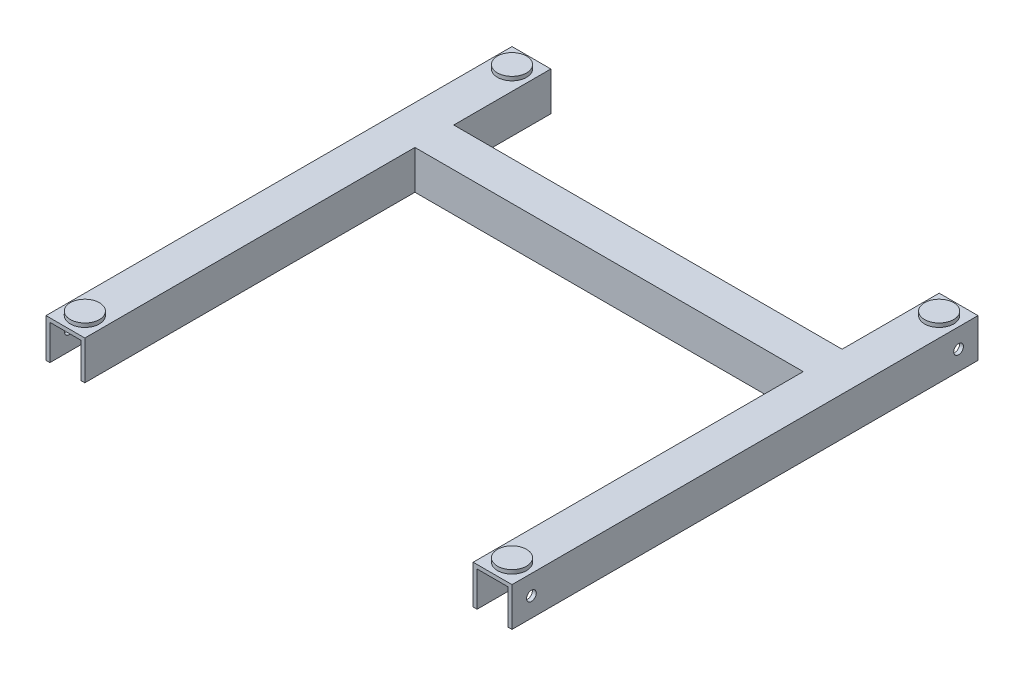
ISO-10303-21;
HEADER;
FILE_DESCRIPTION(('STEP AP214'),'2;1');
FILE_NAME('part.step','',(''),(''),'','','');
FILE_SCHEMA(('AUTOMOTIVE_DESIGN { 1 0 10303 214 1 1 1 1 }'));
ENDSEC;
DATA;
#1=APPLICATION_CONTEXT('core data for automotive mechanical design processes');
#2=APPLICATION_PROTOCOL_DEFINITION('international standard','automotive_design',2000,#1);
#3=PRODUCT_CONTEXT('',#1,'mechanical');
#4=PRODUCT('Part','Part','',(#3));
#5=PRODUCT_RELATED_PRODUCT_CATEGORY('part','',(#4));
#6=PRODUCT_DEFINITION_FORMATION('','',#4);
#7=PRODUCT_DEFINITION_CONTEXT('part definition',#1,'design');
#8=PRODUCT_DEFINITION('design','',#6,#7);
#9=PRODUCT_DEFINITION_SHAPE('','',#8);
#10=(LENGTH_UNIT() NAMED_UNIT(*) SI_UNIT(.MILLI.,.METRE.));
#11=(NAMED_UNIT(*) PLANE_ANGLE_UNIT() SI_UNIT($,.RADIAN.));
#12=(NAMED_UNIT(*) SI_UNIT($,.STERADIAN.) SOLID_ANGLE_UNIT());
#13=UNCERTAINTY_MEASURE_WITH_UNIT(LENGTH_MEASURE(1.E-05),#10,'distance_accuracy_value','');
#14=(GEOMETRIC_REPRESENTATION_CONTEXT(3) GLOBAL_UNCERTAINTY_ASSIGNED_CONTEXT((#13)) GLOBAL_UNIT_ASSIGNED_CONTEXT((#10,
#11,#12)) REPRESENTATION_CONTEXT('',''));
#15=CARTESIAN_POINT('',(0.,0.,0.));
#16=DIRECTION('',(0.,0.,1.));
#17=DIRECTION('',(1.,0.,0.));
#18=AXIS2_PLACEMENT_3D('',#15,#16,#17);
#19=CARTESIAN_POINT('',(25.4,25.4,0.));
#20=DIRECTION('',(-1.,0.,0.));
#21=DIRECTION('',(0.,0.,1.));
#22=AXIS2_PLACEMENT_3D('',#19,#20,#21);
#23=PLANE('',#22);
#24=DIRECTION('',(0.,-1.,0.));
#25=VECTOR('',#24,1.);
#26=CARTESIAN_POINT('',(25.4,0.,-215.9));
#27=LINE('',#26,#25);
#28=CARTESIAN_POINT('',(25.4,25.4,-215.9));
#29=VERTEX_POINT('',#28);
#30=CARTESIAN_POINT('',(25.4,0.,-215.9));
#31=VERTEX_POINT('',#30);
#32=EDGE_CURVE('E65',#29,#31,#27,.T.);
#33=ORIENTED_EDGE('',*,*,#32,.F.);
#34=DIRECTION('',(0.,0.,-1.));
#35=VECTOR('',#34,1.);
#36=CARTESIAN_POINT('',(25.4,25.4,0.));
#37=LINE('',#36,#35);
#38=CARTESIAN_POINT('',(25.4,25.4,0.));
#39=VERTEX_POINT('',#38);
#40=EDGE_CURVE('E451',#39,#29,#37,.T.);
#41=ORIENTED_EDGE('',*,*,#40,.F.);
#42=DIRECTION('',(0.,-1.,0.));
#43=VECTOR('',#42,1.);
#44=CARTESIAN_POINT('',(25.4,25.4,0.));
#45=LINE('',#44,#43);
#46=CARTESIAN_POINT('',(25.4,0.,0.));
#47=VERTEX_POINT('',#46);
#48=EDGE_CURVE('E481',#39,#47,#45,.T.);
#49=ORIENTED_EDGE('',*,*,#48,.T.);
#50=DIRECTION('',(0.,0.,-1.));
#51=VECTOR('',#50,1.);
#52=CARTESIAN_POINT('',(25.4,0.,0.));
#53=LINE('',#52,#51);
#54=EDGE_CURVE('E467',#47,#31,#53,.T.);
#55=ORIENTED_EDGE('',*,*,#54,.T.);
#56=EDGE_LOOP('',(#33,#41,#49,#55));
#57=FACE_BOUND('',#56,.T.);
#58=ADVANCED_FACE('F47',(#57),#23,.F.);
#59=DIRECTION('',(0.,1.,0.));
#60=VECTOR('',#59,1.);
#61=CARTESIAN_POINT('',(25.4,0.,-241.3));
#62=LINE('',#61,#60);
#63=CARTESIAN_POINT('',(25.4,0.,-241.3));
#64=VERTEX_POINT('',#63);
#65=CARTESIAN_POINT('',(25.4,25.4,-241.3));
#66=VERTEX_POINT('',#65);
#67=EDGE_CURVE('E73',#64,#66,#62,.T.);
#68=ORIENTED_EDGE('',*,*,#67,.F.);
#69=CARTESIAN_POINT('',(25.4,0.,-304.8));
#70=VERTEX_POINT('',#69);
#71=EDGE_CURVE('E466',#64,#70,#53,.T.);
#72=ORIENTED_EDGE('',*,*,#71,.T.);
#73=DIRECTION('',(0.,-1.,0.));
#74=VECTOR('',#73,1.);
#75=CARTESIAN_POINT('',(25.4,25.4,-304.8));
#76=LINE('',#75,#74);
#77=CARTESIAN_POINT('',(25.4,25.4,-304.8));
#78=VERTEX_POINT('',#77);
#79=EDGE_CURVE('E477',#78,#70,#76,.T.);
#80=ORIENTED_EDGE('',*,*,#79,.F.);
#81=EDGE_CURVE('E450',#66,#78,#37,.T.);
#82=ORIENTED_EDGE('',*,*,#81,.F.);
#83=EDGE_LOOP('',(#68,#72,#80,#82));
#84=FACE_BOUND('',#83,.T.);
#85=ADVANCED_FACE('F596',(#84),#23,.F.);
#86=CARTESIAN_POINT('',(0.,0.,0.));
#87=DIRECTION('',(0.,-1.,0.));
#88=DIRECTION('',(0.,0.,-1.));
#89=AXIS2_PLACEMENT_3D('',#86,#87,#88);
#90=PLANE('',#89);
#91=DIRECTION('',(0.,0.,1.));
#92=VECTOR('',#91,1.);
#93=CARTESIAN_POINT('',(2.54,0.,-304.8));
#94=LINE('',#93,#92);
#95=CARTESIAN_POINT('',(2.54,0.,-304.8));
#96=VERTEX_POINT('',#95);
#97=CARTESIAN_POINT('',(2.54,0.,0.));
#98=VERTEX_POINT('',#97);
#99=EDGE_CURVE('E419',#96,#98,#94,.T.);
#100=ORIENTED_EDGE('',*,*,#99,.T.);
#101=DIRECTION('',(1.,0.,0.));
#102=VECTOR('',#101,1.);
#103=CARTESIAN_POINT('',(0.,0.,0.));
#104=LINE('',#103,#102);
#105=CARTESIAN_POINT('',(0.,0.,0.));
#106=VERTEX_POINT('',#105);
#107=EDGE_CURVE('E462',#106,#98,#104,.T.);
#108=ORIENTED_EDGE('',*,*,#107,.F.);
#109=DIRECTION('',(0.,0.,1.));
#110=VECTOR('',#109,1.);
#111=CARTESIAN_POINT('',(0.,0.,0.));
#112=LINE('',#111,#110);
#113=CARTESIAN_POINT('',(0.,0.,-304.8));
#114=VERTEX_POINT('',#113);
#115=EDGE_CURVE('E432',#114,#106,#112,.T.);
#116=ORIENTED_EDGE('',*,*,#115,.F.);
#117=DIRECTION('',(-1.,0.,0.));
#118=VECTOR('',#117,1.);
#119=CARTESIAN_POINT('',(0.,0.,-304.8));
#120=LINE('',#119,#118);
#121=EDGE_CURVE('E470',#96,#114,#120,.T.);
#122=ORIENTED_EDGE('',*,*,#121,.F.);
#123=EDGE_LOOP('',(#100,#108,#116,#122));
#124=FACE_BOUND('',#123,.T.);
#125=ADVANCED_FACE('F603',(#124),#90,.T.);
#126=CARTESIAN_POINT('',(0.,25.4,0.));
#127=DIRECTION('',(1.,0.,0.));
#128=DIRECTION('',(0.,0.,-1.));
#129=AXIS2_PLACEMENT_3D('',#126,#127,#128);
#130=PLANE('',#129);
#131=CARTESIAN_POINT('',(0.,12.7,-292.1));
#132=DIRECTION('',(-1.,0.,0.));
#133=DIRECTION('',(0.,0.,1.));
#134=AXIS2_PLACEMENT_3D('',#131,#132,#133);
#135=CIRCLE('',#134,3.17499999999997);
#136=CARTESIAN_POINT('',(0.,12.7,-288.925));
#137=VERTEX_POINT('',#136);
#138=EDGE_CURVE('E502',#137,#137,#135,.T.);
#139=ORIENTED_EDGE('',*,*,#138,.F.);
#140=EDGE_LOOP('',(#139));
#141=FACE_BOUND('',#140,.T.);
#142=CARTESIAN_POINT('',(0.,12.7,-12.7));
#143=DIRECTION('',(-1.,0.,0.));
#144=DIRECTION('',(0.,0.,1.));
#145=AXIS2_PLACEMENT_3D('',#142,#143,#144);
#146=CIRCLE('',#145,3.175);
#147=CARTESIAN_POINT('',(0.,12.7,-9.525));
#148=VERTEX_POINT('',#147);
#149=EDGE_CURVE('E510',#148,#148,#146,.T.);
#150=ORIENTED_EDGE('',*,*,#149,.F.);
#151=EDGE_LOOP('',(#150));
#152=FACE_BOUND('',#151,.T.);
#153=ORIENTED_EDGE('',*,*,#115,.T.);
#154=DIRECTION('',(0.,-1.,0.));
#155=VECTOR('',#154,1.);
#156=CARTESIAN_POINT('',(0.,25.4,0.));
#157=LINE('',#156,#155);
#158=CARTESIAN_POINT('',(0.,25.4,0.));
#159=VERTEX_POINT('',#158);
#160=EDGE_CURVE('E485',#159,#106,#157,.T.);
#161=ORIENTED_EDGE('',*,*,#160,.F.);
#162=DIRECTION('',(0.,0.,1.));
#163=VECTOR('',#162,1.);
#164=CARTESIAN_POINT('',(0.,25.4,0.));
#165=LINE('',#164,#163);
#166=CARTESIAN_POINT('',(0.,25.4,-304.8));
#167=VERTEX_POINT('',#166);
#168=EDGE_CURVE('E442',#167,#159,#165,.T.);
#169=ORIENTED_EDGE('',*,*,#168,.F.);
#170=DIRECTION('',(0.,-1.,0.));
#171=VECTOR('',#170,1.);
#172=CARTESIAN_POINT('',(0.,25.4,-304.8));
#173=LINE('',#172,#171);
#174=EDGE_CURVE('E457',#167,#114,#173,.T.);
#175=ORIENTED_EDGE('',*,*,#174,.T.);
#176=EDGE_LOOP('',(#153,#161,#169,#175));
#177=FACE_BOUND('',#176,.T.);
#178=ADVANCED_FACE('F49',(#141,#152,#177),#130,.F.);
#179=CARTESIAN_POINT('',(0.,25.4,0.));
#180=DIRECTION('',(0.,0.,-1.));
#181=DIRECTION('',(-1.,0.,0.));
#182=AXIS2_PLACEMENT_3D('',#179,#180,#181);
#183=PLANE('',#182);
#184=ORIENTED_EDGE('',*,*,#107,.T.);
#185=DIRECTION('',(0.,-1.,0.));
#186=VECTOR('',#185,1.);
#187=CARTESIAN_POINT('',(2.54,0.,0.));
#188=LINE('',#187,#186);
#189=CARTESIAN_POINT('',(2.54,22.86,0.));
#190=VERTEX_POINT('',#189);
#191=EDGE_CURVE('E402',#190,#98,#188,.T.);
#192=ORIENTED_EDGE('',*,*,#191,.F.);
#193=DIRECTION('',(-1.,0.,0.));
#194=VECTOR('',#193,1.);
#195=CARTESIAN_POINT('',(2.54,22.86,0.));
#196=LINE('',#195,#194);
#197=CARTESIAN_POINT('',(22.86,22.86,0.));
#198=VERTEX_POINT('',#197);
#199=EDGE_CURVE('E411',#198,#190,#196,.T.);
#200=ORIENTED_EDGE('',*,*,#199,.F.);
#201=DIRECTION('',(0.,1.,0.));
#202=VECTOR('',#201,1.);
#203=CARTESIAN_POINT('',(22.86,0.,0.));
#204=LINE('',#203,#202);
#205=CARTESIAN_POINT('',(22.86,0.,0.));
#206=VERTEX_POINT('',#205);
#207=EDGE_CURVE('E422',#206,#198,#204,.T.);
#208=ORIENTED_EDGE('',*,*,#207,.F.);
#209=EDGE_CURVE('E461',#206,#47,#104,.T.);
#210=ORIENTED_EDGE('',*,*,#209,.T.);
#211=ORIENTED_EDGE('',*,*,#48,.F.);
#212=DIRECTION('',(1.,0.,0.));
#213=VECTOR('',#212,1.);
#214=CARTESIAN_POINT('',(0.,25.4,0.));
#215=LINE('',#214,#213);
#216=EDGE_CURVE('E446',#159,#39,#215,.T.);
#217=ORIENTED_EDGE('',*,*,#216,.F.);
#218=ORIENTED_EDGE('',*,*,#160,.T.);
#219=EDGE_LOOP('',(#184,#192,#200,#208,#210,#211,#217,#218));
#220=FACE_BOUND('',#219,.T.);
#221=ADVANCED_FACE('F564',(#220),#183,.F.);
#222=CARTESIAN_POINT('',(0.,25.4,-304.8));
#223=DIRECTION('',(0.,0.,1.));
#224=DIRECTION('',(1.,0.,0.));
#225=AXIS2_PLACEMENT_3D('',#222,#223,#224);
#226=PLANE('',#225);
#227=DIRECTION('',(-1.,0.,0.));
#228=VECTOR('',#227,1.);
#229=CARTESIAN_POINT('',(2.54,22.86,-304.8));
#230=LINE('',#229,#228);
#231=CARTESIAN_POINT('',(22.86,22.86,-304.8));
#232=VERTEX_POINT('',#231);
#233=CARTESIAN_POINT('',(2.54,22.86,-304.8));
#234=VERTEX_POINT('',#233);
#235=EDGE_CURVE('E415',#232,#234,#230,.T.);
#236=ORIENTED_EDGE('',*,*,#235,.T.);
#237=DIRECTION('',(0.,-1.,0.));
#238=VECTOR('',#237,1.);
#239=CARTESIAN_POINT('',(2.54,0.,-304.8));
#240=LINE('',#239,#238);
#241=EDGE_CURVE('E406',#234,#96,#240,.T.);
#242=ORIENTED_EDGE('',*,*,#241,.T.);
#243=ORIENTED_EDGE('',*,*,#121,.T.);
#244=ORIENTED_EDGE('',*,*,#174,.F.);
#245=DIRECTION('',(-1.,0.,0.));
#246=VECTOR('',#245,1.);
#247=CARTESIAN_POINT('',(0.,25.4,-304.8));
#248=LINE('',#247,#246);
#249=EDGE_CURVE('E454',#78,#167,#248,.T.);
#250=ORIENTED_EDGE('',*,*,#249,.F.);
#251=ORIENTED_EDGE('',*,*,#79,.T.);
#252=CARTESIAN_POINT('',(22.86,0.,-304.8));
#253=VERTEX_POINT('',#252);
#254=EDGE_CURVE('E447',#70,#253,#120,.T.);
#255=ORIENTED_EDGE('',*,*,#254,.T.);
#256=DIRECTION('',(0.,1.,0.));
#257=VECTOR('',#256,1.);
#258=CARTESIAN_POINT('',(22.86,0.,-304.8));
#259=LINE('',#258,#257);
#260=EDGE_CURVE('E410',#253,#232,#259,.T.);
#261=ORIENTED_EDGE('',*,*,#260,.T.);
#262=EDGE_LOOP('',(#236,#242,#243,#244,#250,#251,#255,#261));
#263=FACE_BOUND('',#262,.T.);
#264=ADVANCED_FACE('F605',(#263),#226,.F.);
#265=CARTESIAN_POINT('',(0.,25.4,0.));
#266=DIRECTION('',(0.,-1.,0.));
#267=DIRECTION('',(0.,0.,-1.));
#268=AXIS2_PLACEMENT_3D('',#265,#266,#267);
#269=PLANE('',#268);
#270=CARTESIAN_POINT('',(12.7,25.4,-12.7));
#271=DIRECTION('',(0.,-1.,0.));
#272=DIRECTION('',(0.,0.,-1.));
#273=AXIS2_PLACEMENT_3D('',#270,#271,#272);
#274=CIRCLE('',#273,9.525);
#275=CARTESIAN_POINT('',(12.7,25.4,-22.225));
#276=VERTEX_POINT('',#275);
#277=EDGE_CURVE('E11',#276,#276,#274,.F.);
#278=ORIENTED_EDGE('',*,*,#277,.F.);
#279=EDGE_LOOP('',(#278));
#280=FACE_BOUND('',#279,.T.);
#281=CARTESIAN_POINT('',(12.7,25.4,-292.1));
#282=DIRECTION('',(0.,-1.,0.));
#283=DIRECTION('',(0.,0.,-1.));
#284=AXIS2_PLACEMENT_3D('',#281,#282,#283);
#285=CIRCLE('',#284,9.525);
#286=CARTESIAN_POINT('',(12.7,25.4,-301.625));
#287=VERTEX_POINT('',#286);
#288=EDGE_CURVE('E57',#287,#287,#285,.F.);
#289=ORIENTED_EDGE('',*,*,#288,.F.);
#290=EDGE_LOOP('',(#289));
#291=FACE_BOUND('',#290,.T.);
#292=ORIENTED_EDGE('',*,*,#168,.T.);
#293=ORIENTED_EDGE('',*,*,#216,.T.);
#294=ORIENTED_EDGE('',*,*,#40,.T.);
#295=DIRECTION('',(-1.,0.,0.));
#296=VECTOR('',#295,1.);
#297=CARTESIAN_POINT('',(152.4,25.4,-215.9));
#298=LINE('',#297,#296);
#299=CARTESIAN_POINT('',(279.4,25.4,-215.9));
#300=VERTEX_POINT('',#299);
#301=EDGE_CURVE('E381',#300,#29,#298,.T.);
#302=ORIENTED_EDGE('',*,*,#301,.F.);
#303=DIRECTION('',(0.,0.,-1.));
#304=VECTOR('',#303,1.);
#305=CARTESIAN_POINT('',(279.4,25.4,0.));
#306=LINE('',#305,#304);
#307=CARTESIAN_POINT('',(279.4,25.4,0.));
#308=VERTEX_POINT('',#307);
#309=EDGE_CURVE('E312',#308,#300,#306,.T.);
#310=ORIENTED_EDGE('',*,*,#309,.F.);
#311=DIRECTION('',(-1.,0.,0.));
#312=VECTOR('',#311,1.);
#313=CARTESIAN_POINT('',(304.8,25.4,0.));
#314=LINE('',#313,#312);
#315=CARTESIAN_POINT('',(304.8,25.4,0.));
#316=VERTEX_POINT('',#315);
#317=EDGE_CURVE('E307',#316,#308,#314,.T.);
#318=ORIENTED_EDGE('',*,*,#317,.F.);
#319=DIRECTION('',(0.,0.,1.));
#320=VECTOR('',#319,1.);
#321=CARTESIAN_POINT('',(304.8,25.4,0.));
#322=LINE('',#321,#320);
#323=CARTESIAN_POINT('',(304.8,25.4,-304.8));
#324=VERTEX_POINT('',#323);
#325=EDGE_CURVE('E303',#324,#316,#322,.T.);
#326=ORIENTED_EDGE('',*,*,#325,.F.);
#327=DIRECTION('',(1.,0.,0.));
#328=VECTOR('',#327,1.);
#329=CARTESIAN_POINT('',(304.8,25.4,-304.8));
#330=LINE('',#329,#328);
#331=CARTESIAN_POINT('',(279.4,25.4,-304.8));
#332=VERTEX_POINT('',#331);
#333=EDGE_CURVE('E316',#332,#324,#330,.T.);
#334=ORIENTED_EDGE('',*,*,#333,.F.);
#335=CARTESIAN_POINT('',(279.4,25.4,-241.3));
#336=VERTEX_POINT('',#335);
#337=EDGE_CURVE('E311',#336,#332,#306,.T.);
#338=ORIENTED_EDGE('',*,*,#337,.F.);
#339=DIRECTION('',(-1.,0.,0.));
#340=VECTOR('',#339,1.);
#341=CARTESIAN_POINT('',(152.4,25.4,-241.3));
#342=LINE('',#341,#340);
#343=EDGE_CURVE('E385',#336,#66,#342,.T.);
#344=ORIENTED_EDGE('',*,*,#343,.T.);
#345=ORIENTED_EDGE('',*,*,#81,.T.);
#346=ORIENTED_EDGE('',*,*,#249,.T.);
#347=EDGE_LOOP('',(#292,#293,#294,#302,#310,#318,#326,#334,#338,#344,#345,#346));
#348=FACE_BOUND('',#347,.T.);
#349=CARTESIAN_POINT('',(292.1,25.4,-12.7));
#350=DIRECTION('',(0.,1.,0.));
#351=DIRECTION('',(0.,0.,-1.));
#352=AXIS2_PLACEMENT_3D('',#349,#350,#351);
#353=CIRCLE('',#352,9.525);
#354=CARTESIAN_POINT('',(292.1,25.4,-22.225));
#355=VERTEX_POINT('',#354);
#356=EDGE_CURVE('E354',#355,#355,#353,.F.);
#357=ORIENTED_EDGE('',*,*,#356,.T.);
#358=EDGE_LOOP('',(#357));
#359=FACE_BOUND('',#358,.T.);
#360=CARTESIAN_POINT('',(292.1,25.4,-292.1));
#361=DIRECTION('',(0.,1.,0.));
#362=DIRECTION('',(0.,0.,-1.));
#363=AXIS2_PLACEMENT_3D('',#360,#361,#362);
#364=CIRCLE('',#363,9.525);
#365=CARTESIAN_POINT('',(292.1,25.4,-301.625));
#366=VERTEX_POINT('',#365);
#367=EDGE_CURVE('E350',#366,#366,#364,.F.);
#368=ORIENTED_EDGE('',*,*,#367,.T.);
#369=EDGE_LOOP('',(#368));
#370=FACE_BOUND('',#369,.T.);
#371=ADVANCED_FACE('F578',(#280,#291,#348,#359,#370),#269,.F.);
#372=DIRECTION('',(1.,0.,0.));
#373=VECTOR('',#372,1.);
#374=CARTESIAN_POINT('',(25.4,0.,-218.44));
#375=LINE('',#374,#373);
#376=CARTESIAN_POINT('',(25.4,0.,-218.44));
#377=VERTEX_POINT('',#376);
#378=CARTESIAN_POINT('',(279.4,0.,-218.44));
#379=VERTEX_POINT('',#378);
#380=EDGE_CURVE('E212',#377,#379,#375,.T.);
#381=ORIENTED_EDGE('',*,*,#380,.T.);
#382=DIRECTION('',(0.,0.,-1.));
#383=VECTOR('',#382,1.);
#384=CARTESIAN_POINT('',(279.4,0.,-218.44));
#385=LINE('',#384,#383);
#386=CARTESIAN_POINT('',(279.4,0.,-238.76));
#387=VERTEX_POINT('',#386);
#388=EDGE_CURVE('E218',#379,#387,#385,.T.);
#389=ORIENTED_EDGE('',*,*,#388,.T.);
#390=DIRECTION('',(1.,0.,0.));
#391=VECTOR('',#390,1.);
#392=CARTESIAN_POINT('',(25.4,0.,-238.76));
#393=LINE('',#392,#391);
#394=CARTESIAN_POINT('',(25.4,0.,-238.76));
#395=VERTEX_POINT('',#394);
#396=EDGE_CURVE('E225',#395,#387,#393,.T.);
#397=ORIENTED_EDGE('',*,*,#396,.F.);
#398=DIRECTION('',(0.,0.,-1.));
#399=VECTOR('',#398,1.);
#400=CARTESIAN_POINT('',(25.4,0.,-218.44));
#401=LINE('',#400,#399);
#402=EDGE_CURVE('E220',#377,#395,#401,.T.);
#403=ORIENTED_EDGE('',*,*,#402,.F.);
#404=EDGE_LOOP('',(#381,#389,#397,#403));
#405=FACE_BOUND('',#404,.T.);
#406=DIRECTION('',(0.,0.,-1.));
#407=VECTOR('',#406,1.);
#408=CARTESIAN_POINT('',(279.4,0.,0.));
#409=LINE('',#408,#407);
#410=CARTESIAN_POINT('',(279.4,0.,0.));
#411=VERTEX_POINT('',#410);
#412=CARTESIAN_POINT('',(279.4,0.,-215.9));
#413=VERTEX_POINT('',#412);
#414=EDGE_CURVE('E329',#411,#413,#409,.T.);
#415=ORIENTED_EDGE('',*,*,#414,.T.);
#416=DIRECTION('',(-1.,0.,0.));
#417=VECTOR('',#416,1.);
#418=CARTESIAN_POINT('',(152.4,0.,-215.9));
#419=LINE('',#418,#417);
#420=EDGE_CURVE('E393',#413,#31,#419,.T.);
#421=ORIENTED_EDGE('',*,*,#420,.T.);
#422=ORIENTED_EDGE('',*,*,#54,.F.);
#423=ORIENTED_EDGE('',*,*,#209,.F.);
#424=DIRECTION('',(0.,0.,1.));
#425=VECTOR('',#424,1.);
#426=CARTESIAN_POINT('',(22.86,0.,-304.8));
#427=LINE('',#426,#425);
#428=EDGE_CURVE('E436',#253,#206,#427,.T.);
#429=ORIENTED_EDGE('',*,*,#428,.F.);
#430=ORIENTED_EDGE('',*,*,#254,.F.);
#431=ORIENTED_EDGE('',*,*,#71,.F.);
#432=DIRECTION('',(-1.,0.,0.));
#433=VECTOR('',#432,1.);
#434=CARTESIAN_POINT('',(152.4,0.,-241.3));
#435=LINE('',#434,#433);
#436=CARTESIAN_POINT('',(279.4,0.,-241.3));
#437=VERTEX_POINT('',#436);
#438=EDGE_CURVE('E389',#437,#64,#435,.T.);
#439=ORIENTED_EDGE('',*,*,#438,.F.);
#440=CARTESIAN_POINT('',(279.4,0.,-304.8));
#441=VERTEX_POINT('',#440);
#442=EDGE_CURVE('E328',#437,#441,#409,.T.);
#443=ORIENTED_EDGE('',*,*,#442,.T.);
#444=DIRECTION('',(1.,0.,0.));
#445=VECTOR('',#444,1.);
#446=CARTESIAN_POINT('',(304.8,0.,-304.8));
#447=LINE('',#446,#445);
#448=CARTESIAN_POINT('',(281.94,0.,-304.8));
#449=VERTEX_POINT('',#448);
#450=EDGE_CURVE('E308',#441,#449,#447,.T.);
#451=ORIENTED_EDGE('',*,*,#450,.T.);
#452=DIRECTION('',(0.,0.,1.));
#453=VECTOR('',#452,1.);
#454=CARTESIAN_POINT('',(281.94,0.,-304.8));
#455=LINE('',#454,#453);
#456=CARTESIAN_POINT('',(281.94,0.,0.));
#457=VERTEX_POINT('',#456);
#458=EDGE_CURVE('E297',#449,#457,#455,.T.);
#459=ORIENTED_EDGE('',*,*,#458,.T.);
#460=DIRECTION('',(-1.,0.,0.));
#461=VECTOR('',#460,1.);
#462=CARTESIAN_POINT('',(304.8,0.,0.));
#463=LINE('',#462,#461);
#464=EDGE_CURVE('E323',#457,#411,#463,.T.);
#465=ORIENTED_EDGE('',*,*,#464,.T.);
#466=EDGE_LOOP('',(#415,#421,#422,#423,#429,#430,#431,#439,#443,#451,#459,#465));
#467=FACE_BOUND('',#466,.T.);
#468=ADVANCED_FACE('F214',(#405,#467),#90,.T.);
#469=CARTESIAN_POINT('',(2.54,0.,-304.8));
#470=DIRECTION('',(-1.,0.,0.));
#471=DIRECTION('',(0.,0.,1.));
#472=AXIS2_PLACEMENT_3D('',#469,#470,#471);
#473=PLANE('',#472);
#474=CARTESIAN_POINT('',(2.54,12.7,-292.1));
#475=DIRECTION('',(-1.,0.,0.));
#476=DIRECTION('',(0.,0.,1.));
#477=AXIS2_PLACEMENT_3D('',#474,#475,#476);
#478=CIRCLE('',#477,3.17499999999997);
#479=CARTESIAN_POINT('',(2.54,12.7,-288.925));
#480=VERTEX_POINT('',#479);
#481=EDGE_CURVE('E51',#480,#480,#478,.T.);
#482=ORIENTED_EDGE('',*,*,#481,.T.);
#483=EDGE_LOOP('',(#482));
#484=FACE_BOUND('',#483,.T.);
#485=CARTESIAN_POINT('',(2.54,12.7,-12.7));
#486=DIRECTION('',(-1.,0.,0.));
#487=DIRECTION('',(0.,0.,1.));
#488=AXIS2_PLACEMENT_3D('',#485,#486,#487);
#489=CIRCLE('',#488,3.175);
#490=CARTESIAN_POINT('',(2.54,12.7,-9.525));
#491=VERTEX_POINT('',#490);
#492=EDGE_CURVE('E499',#491,#491,#489,.T.);
#493=ORIENTED_EDGE('',*,*,#492,.T.);
#494=EDGE_LOOP('',(#493));
#495=FACE_BOUND('',#494,.T.);
#496=ORIENTED_EDGE('',*,*,#191,.T.);
#497=ORIENTED_EDGE('',*,*,#99,.F.);
#498=ORIENTED_EDGE('',*,*,#241,.F.);
#499=DIRECTION('',(0.,0.,1.));
#500=VECTOR('',#499,1.);
#501=CARTESIAN_POINT('',(2.54,22.86,-304.8));
#502=LINE('',#501,#500);
#503=EDGE_CURVE('E429',#234,#190,#502,.T.);
#504=ORIENTED_EDGE('',*,*,#503,.T.);
#505=EDGE_LOOP('',(#496,#497,#498,#504));
#506=FACE_BOUND('',#505,.T.);
#507=ADVANCED_FACE('F631',(#484,#495,#506),#473,.F.);
#508=CARTESIAN_POINT('',(2.54,22.86,-304.8));
#509=DIRECTION('',(0.,1.,0.));
#510=DIRECTION('',(0.,0.,1.));
#511=AXIS2_PLACEMENT_3D('',#508,#509,#510);
#512=PLANE('',#511);
#513=ORIENTED_EDGE('',*,*,#199,.T.);
#514=ORIENTED_EDGE('',*,*,#503,.F.);
#515=ORIENTED_EDGE('',*,*,#235,.F.);
#516=DIRECTION('',(0.,0.,1.));
#517=VECTOR('',#516,1.);
#518=CARTESIAN_POINT('',(22.86,22.86,-304.8));
#519=LINE('',#518,#517);
#520=EDGE_CURVE('E433',#232,#198,#519,.T.);
#521=ORIENTED_EDGE('',*,*,#520,.T.);
#522=EDGE_LOOP('',(#513,#514,#515,#521));
#523=FACE_BOUND('',#522,.T.);
#524=ADVANCED_FACE('F635',(#523),#512,.F.);
#525=CARTESIAN_POINT('',(22.86,0.,-304.8));
#526=DIRECTION('',(1.,0.,0.));
#527=DIRECTION('',(0.,0.,-1.));
#528=AXIS2_PLACEMENT_3D('',#525,#526,#527);
#529=PLANE('',#528);
#530=ORIENTED_EDGE('',*,*,#207,.T.);
#531=ORIENTED_EDGE('',*,*,#520,.F.);
#532=ORIENTED_EDGE('',*,*,#260,.F.);
#533=ORIENTED_EDGE('',*,*,#428,.T.);
#534=EDGE_LOOP('',(#530,#531,#532,#533));
#535=FACE_BOUND('',#534,.T.);
#536=ADVANCED_FACE('F637',(#535),#529,.F.);
#537=CARTESIAN_POINT('',(12.7,27.94,-292.1));
#538=DIRECTION('',(0.,-1.,0.));
#539=DIRECTION('',(0.,0.,-1.));
#540=AXIS2_PLACEMENT_3D('',#537,#538,#539);
#541=CYLINDRICAL_SURFACE('',#540,9.525);
#542=CARTESIAN_POINT('',(12.7,27.94,-292.1));
#543=DIRECTION('',(0.,1.,0.));
#544=DIRECTION('',(0.,0.,1.));
#545=AXIS2_PLACEMENT_3D('',#542,#543,#544);
#546=CIRCLE('',#545,9.525);
#547=CARTESIAN_POINT('',(12.7,27.94,-282.575));
#548=VERTEX_POINT('',#547);
#549=EDGE_CURVE('E397',#548,#548,#546,.T.);
#550=ORIENTED_EDGE('',*,*,#549,.F.);
#551=EDGE_LOOP('',(#550));
#552=FACE_BOUND('',#551,.T.);
#553=ORIENTED_EDGE('',*,*,#288,.T.);
#554=EDGE_LOOP('',(#553));
#555=FACE_BOUND('',#554,.T.);
#556=ADVANCED_FACE('F830',(#552,#555),#541,.T.);
#557=CARTESIAN_POINT('',(12.7,27.94,-292.1));
#558=DIRECTION('',(0.,1.,0.));
#559=DIRECTION('',(0.,0.,1.));
#560=AXIS2_PLACEMENT_3D('',#557,#558,#559);
#561=PLANE('',#560);
#562=ORIENTED_EDGE('',*,*,#549,.T.);
#563=EDGE_LOOP('',(#562));
#564=FACE_BOUND('',#563,.T.);
#565=ADVANCED_FACE('F832',(#564),#561,.T.);
#566=CARTESIAN_POINT('',(12.7,27.94,-12.7));
#567=DIRECTION('',(0.,-1.,0.));
#568=DIRECTION('',(0.,0.,-1.));
#569=AXIS2_PLACEMENT_3D('',#566,#567,#568);
#570=CYLINDRICAL_SURFACE('',#569,9.525);
#571=CARTESIAN_POINT('',(12.7,27.94,-12.7));
#572=DIRECTION('',(0.,1.,0.));
#573=DIRECTION('',(0.,0.,1.));
#574=AXIS2_PLACEMENT_3D('',#571,#572,#573);
#575=CIRCLE('',#574,9.525);
#576=CARTESIAN_POINT('',(12.7,27.94,-3.175));
#577=VERTEX_POINT('',#576);
#578=EDGE_CURVE('E398',#577,#577,#575,.T.);
#579=ORIENTED_EDGE('',*,*,#578,.F.);
#580=EDGE_LOOP('',(#579));
#581=FACE_BOUND('',#580,.T.);
#582=ORIENTED_EDGE('',*,*,#277,.T.);
#583=EDGE_LOOP('',(#582));
#584=FACE_BOUND('',#583,.T.);
#585=ADVANCED_FACE('F839',(#581,#584),#570,.T.);
#586=CARTESIAN_POINT('',(12.7,27.94,-12.7));
#587=DIRECTION('',(0.,1.,0.));
#588=DIRECTION('',(0.,0.,1.));
#589=AXIS2_PLACEMENT_3D('',#586,#587,#588);
#590=PLANE('',#589);
#591=ORIENTED_EDGE('',*,*,#578,.T.);
#592=EDGE_LOOP('',(#591));
#593=FACE_BOUND('',#592,.T.);
#594=ADVANCED_FACE('F593',(#593),#590,.T.);
#595=CARTESIAN_POINT('',(152.4,0.,-215.9));
#596=DIRECTION('',(0.,0.,-1.));
#597=DIRECTION('',(-1.,0.,0.));
#598=AXIS2_PLACEMENT_3D('',#595,#596,#597);
#599=PLANE('',#598);
#600=ORIENTED_EDGE('',*,*,#32,.T.);
#601=ORIENTED_EDGE('',*,*,#420,.F.);
#602=DIRECTION('',(0.,-1.,0.));
#603=VECTOR('',#602,1.);
#604=CARTESIAN_POINT('',(279.4,0.,-215.9));
#605=LINE('',#604,#603);
#606=EDGE_CURVE('E251',#300,#413,#605,.T.);
#607=ORIENTED_EDGE('',*,*,#606,.F.);
#608=ORIENTED_EDGE('',*,*,#301,.T.);
#609=EDGE_LOOP('',(#600,#601,#607,#608));
#610=FACE_BOUND('',#609,.T.);
#611=ADVANCED_FACE('F558',(#610),#599,.F.);
#612=CARTESIAN_POINT('',(152.4,0.,-241.3));
#613=DIRECTION('',(0.,0.,1.));
#614=DIRECTION('',(1.,0.,0.));
#615=AXIS2_PLACEMENT_3D('',#612,#613,#614);
#616=PLANE('',#615);
#617=ORIENTED_EDGE('',*,*,#67,.T.);
#618=ORIENTED_EDGE('',*,*,#343,.F.);
#619=DIRECTION('',(0.,1.,0.));
#620=VECTOR('',#619,1.);
#621=CARTESIAN_POINT('',(279.4,0.,-241.3));
#622=LINE('',#621,#620);
#623=EDGE_CURVE('E255',#437,#336,#622,.T.);
#624=ORIENTED_EDGE('',*,*,#623,.F.);
#625=ORIENTED_EDGE('',*,*,#438,.T.);
#626=EDGE_LOOP('',(#617,#618,#624,#625));
#627=FACE_BOUND('',#626,.T.);
#628=ADVANCED_FACE('F585',(#627),#616,.F.);
#629=CARTESIAN_POINT('',(25.4,0.,-218.44));
#630=DIRECTION('',(0.,0.,1.));
#631=DIRECTION('',(1.,0.,0.));
#632=AXIS2_PLACEMENT_3D('',#629,#630,#631);
#633=PLANE('',#632);
#634=DIRECTION('',(1.,0.,0.));
#635=VECTOR('',#634,1.);
#636=CARTESIAN_POINT('',(25.4,22.86,-218.44));
#637=LINE('',#636,#635);
#638=CARTESIAN_POINT('',(25.4,22.86,-218.44));
#639=VERTEX_POINT('',#638);
#640=CARTESIAN_POINT('',(279.4,22.86,-218.44));
#641=VERTEX_POINT('',#640);
#642=EDGE_CURVE('E231',#639,#641,#637,.T.);
#643=ORIENTED_EDGE('',*,*,#642,.T.);
#644=DIRECTION('',(0.,-1.,0.));
#645=VECTOR('',#644,1.);
#646=CARTESIAN_POINT('',(279.4,0.,-218.44));
#647=LINE('',#646,#645);
#648=EDGE_CURVE('E229',#641,#379,#647,.T.);
#649=ORIENTED_EDGE('',*,*,#648,.T.);
#650=ORIENTED_EDGE('',*,*,#380,.F.);
#651=DIRECTION('',(0.,-1.,0.));
#652=VECTOR('',#651,1.);
#653=CARTESIAN_POINT('',(25.4,0.,-218.44));
#654=LINE('',#653,#652);
#655=EDGE_CURVE('E358',#639,#377,#654,.T.);
#656=ORIENTED_EDGE('',*,*,#655,.F.);
#657=EDGE_LOOP('',(#643,#649,#650,#656));
#658=FACE_BOUND('',#657,.T.);
#659=ADVANCED_FACE('F230',(#658),#633,.F.);
#660=CARTESIAN_POINT('',(25.4,22.86,-218.44));
#661=DIRECTION('',(0.,1.,0.));
#662=DIRECTION('',(0.,0.,1.));
#663=AXIS2_PLACEMENT_3D('',#660,#661,#662);
#664=PLANE('',#663);
#665=DIRECTION('',(1.,0.,0.));
#666=VECTOR('',#665,1.);
#667=CARTESIAN_POINT('',(25.4,22.86,-238.76));
#668=LINE('',#667,#666);
#669=CARTESIAN_POINT('',(25.4,22.86,-238.76));
#670=VERTEX_POINT('',#669);
#671=CARTESIAN_POINT('',(279.4,22.86,-238.76));
#672=VERTEX_POINT('',#671);
#673=EDGE_CURVE('E372',#670,#672,#668,.T.);
#674=ORIENTED_EDGE('',*,*,#673,.T.);
#675=DIRECTION('',(0.,0.,1.));
#676=VECTOR('',#675,1.);
#677=CARTESIAN_POINT('',(279.4,22.86,-218.44));
#678=LINE('',#677,#676);
#679=EDGE_CURVE('E245',#672,#641,#678,.T.);
#680=ORIENTED_EDGE('',*,*,#679,.T.);
#681=ORIENTED_EDGE('',*,*,#642,.F.);
#682=DIRECTION('',(0.,0.,1.));
#683=VECTOR('',#682,1.);
#684=CARTESIAN_POINT('',(25.4,22.86,-218.44));
#685=LINE('',#684,#683);
#686=EDGE_CURVE('E226',#670,#639,#685,.T.);
#687=ORIENTED_EDGE('',*,*,#686,.F.);
#688=EDGE_LOOP('',(#674,#680,#681,#687));
#689=FACE_BOUND('',#688,.T.);
#690=ADVANCED_FACE('F591',(#689),#664,.F.);
#691=CARTESIAN_POINT('',(25.4,0.,-238.76));
#692=DIRECTION('',(0.,0.,-1.));
#693=DIRECTION('',(-1.,0.,0.));
#694=AXIS2_PLACEMENT_3D('',#691,#692,#693);
#695=PLANE('',#694);
#696=ORIENTED_EDGE('',*,*,#396,.T.);
#697=DIRECTION('',(0.,1.,0.));
#698=VECTOR('',#697,1.);
#699=CARTESIAN_POINT('',(279.4,0.,-238.76));
#700=LINE('',#699,#698);
#701=EDGE_CURVE('E241',#387,#672,#700,.T.);
#702=ORIENTED_EDGE('',*,*,#701,.T.);
#703=ORIENTED_EDGE('',*,*,#673,.F.);
#704=DIRECTION('',(0.,1.,0.));
#705=VECTOR('',#704,1.);
#706=CARTESIAN_POINT('',(25.4,0.,-238.76));
#707=LINE('',#706,#705);
#708=EDGE_CURVE('E363',#395,#670,#707,.T.);
#709=ORIENTED_EDGE('',*,*,#708,.F.);
#710=EDGE_LOOP('',(#696,#702,#703,#709));
#711=FACE_BOUND('',#710,.T.);
#712=ADVANCED_FACE('F678',(#711),#695,.F.);
#713=CARTESIAN_POINT('',(25.4,0.,0.));
#714=DIRECTION('',(-1.,0.,0.));
#715=DIRECTION('',(0.,0.,1.));
#716=AXIS2_PLACEMENT_3D('',#713,#714,#715);
#717=PLANE('',#716);
#718=ORIENTED_EDGE('',*,*,#655,.T.);
#719=ORIENTED_EDGE('',*,*,#402,.T.);
#720=ORIENTED_EDGE('',*,*,#708,.T.);
#721=ORIENTED_EDGE('',*,*,#686,.T.);
#722=EDGE_LOOP('',(#718,#719,#720,#721));
#723=FACE_BOUND('',#722,.T.);
#724=ADVANCED_FACE('F673',(#723),#717,.F.);
#725=CARTESIAN_POINT('',(279.4,25.4,0.));
#726=DIRECTION('',(1.,0.,0.));
#727=DIRECTION('',(0.,0.,1.));
#728=AXIS2_PLACEMENT_3D('',#725,#726,#727);
#729=PLANE('',#728);
#730=ORIENTED_EDGE('',*,*,#606,.T.);
#731=ORIENTED_EDGE('',*,*,#414,.F.);
#732=DIRECTION('',(0.,-1.,0.));
#733=VECTOR('',#732,1.);
#734=CARTESIAN_POINT('',(279.4,25.4,0.));
#735=LINE('',#734,#733);
#736=EDGE_CURVE('E343',#308,#411,#735,.T.);
#737=ORIENTED_EDGE('',*,*,#736,.F.);
#738=ORIENTED_EDGE('',*,*,#309,.T.);
#739=EDGE_LOOP('',(#730,#731,#737,#738));
#740=FACE_BOUND('',#739,.T.);
#741=ADVANCED_FACE('F555',(#740),#729,.F.);
#742=ORIENTED_EDGE('',*,*,#623,.T.);
#743=ORIENTED_EDGE('',*,*,#337,.T.);
#744=DIRECTION('',(0.,-1.,0.));
#745=VECTOR('',#744,1.);
#746=CARTESIAN_POINT('',(279.4,25.4,-304.8));
#747=LINE('',#746,#745);
#748=EDGE_CURVE('E339',#332,#441,#747,.T.);
#749=ORIENTED_EDGE('',*,*,#748,.T.);
#750=ORIENTED_EDGE('',*,*,#442,.F.);
#751=EDGE_LOOP('',(#742,#743,#749,#750));
#752=FACE_BOUND('',#751,.T.);
#753=ADVANCED_FACE('F573',(#752),#729,.F.);
#754=CARTESIAN_POINT('',(304.8,0.,0.));
#755=DIRECTION('',(0.,-1.,0.));
#756=DIRECTION('',(0.,0.,-1.));
#757=AXIS2_PLACEMENT_3D('',#754,#755,#756);
#758=PLANE('',#757);
#759=DIRECTION('',(0.,0.,1.));
#760=VECTOR('',#759,1.);
#761=CARTESIAN_POINT('',(302.26,0.,-304.8));
#762=LINE('',#761,#760);
#763=CARTESIAN_POINT('',(302.26,0.,-304.8));
#764=VERTEX_POINT('',#763);
#765=CARTESIAN_POINT('',(302.26,0.,0.));
#766=VERTEX_POINT('',#765);
#767=EDGE_CURVE('E280',#764,#766,#762,.T.);
#768=ORIENTED_EDGE('',*,*,#767,.F.);
#769=CARTESIAN_POINT('',(304.8,0.,-304.8));
#770=VERTEX_POINT('',#769);
#771=EDGE_CURVE('E333',#764,#770,#447,.T.);
#772=ORIENTED_EDGE('',*,*,#771,.T.);
#773=DIRECTION('',(0.,0.,1.));
#774=VECTOR('',#773,1.);
#775=CARTESIAN_POINT('',(304.8,0.,0.));
#776=LINE('',#775,#774);
#777=CARTESIAN_POINT('',(304.8,0.,0.));
#778=VERTEX_POINT('',#777);
#779=EDGE_CURVE('E293',#770,#778,#776,.T.);
#780=ORIENTED_EDGE('',*,*,#779,.T.);
#781=EDGE_CURVE('E324',#778,#766,#463,.T.);
#782=ORIENTED_EDGE('',*,*,#781,.T.);
#783=EDGE_LOOP('',(#768,#772,#780,#782));
#784=FACE_BOUND('',#783,.T.);
#785=ADVANCED_FACE('F531',(#784),#758,.T.);
#786=CARTESIAN_POINT('',(304.8,25.4,0.));
#787=DIRECTION('',(-1.,0.,0.));
#788=DIRECTION('',(0.,0.,-1.));
#789=AXIS2_PLACEMENT_3D('',#786,#787,#788);
#790=PLANE('',#789);
#791=CARTESIAN_POINT('',(304.8,12.7,-12.7));
#792=DIRECTION('',(1.,0.,0.));
#793=DIRECTION('',(0.,0.,-1.));
#794=AXIS2_PLACEMENT_3D('',#791,#792,#793);
#795=CIRCLE('',#794,3.175);
#796=CARTESIAN_POINT('',(304.8,12.7,-15.875));
#797=VERTEX_POINT('',#796);
#798=EDGE_CURVE('E496',#797,#797,#795,.T.);
#799=ORIENTED_EDGE('',*,*,#798,.F.);
#800=EDGE_LOOP('',(#799));
#801=FACE_BOUND('',#800,.T.);
#802=CARTESIAN_POINT('',(304.8,12.7,-292.1));
#803=DIRECTION('',(1.,0.,0.));
#804=DIRECTION('',(0.,0.,-1.));
#805=AXIS2_PLACEMENT_3D('',#802,#803,#804);
#806=CIRCLE('',#805,3.17499999999997);
#807=CARTESIAN_POINT('',(304.8,12.7,-295.275));
#808=VERTEX_POINT('',#807);
#809=EDGE_CURVE('E508',#808,#808,#806,.T.);
#810=ORIENTED_EDGE('',*,*,#809,.F.);
#811=EDGE_LOOP('',(#810));
#812=FACE_BOUND('',#811,.T.);
#813=ORIENTED_EDGE('',*,*,#779,.F.);
#814=DIRECTION('',(0.,-1.,0.));
#815=VECTOR('',#814,1.);
#816=CARTESIAN_POINT('',(304.8,25.4,-304.8));
#817=LINE('',#816,#815);
#818=EDGE_CURVE('E319',#324,#770,#817,.T.);
#819=ORIENTED_EDGE('',*,*,#818,.F.);
#820=ORIENTED_EDGE('',*,*,#325,.T.);
#821=DIRECTION('',(0.,-1.,0.));
#822=VECTOR('',#821,1.);
#823=CARTESIAN_POINT('',(304.8,25.4,0.));
#824=LINE('',#823,#822);
#825=EDGE_CURVE('E347',#316,#778,#824,.T.);
#826=ORIENTED_EDGE('',*,*,#825,.T.);
#827=EDGE_LOOP('',(#813,#819,#820,#826));
#828=FACE_BOUND('',#827,.T.);
#829=ADVANCED_FACE('F527',(#801,#812,#828),#790,.F.);
#830=CARTESIAN_POINT('',(304.8,25.4,0.));
#831=DIRECTION('',(0.,0.,-1.));
#832=DIRECTION('',(1.,0.,0.));
#833=AXIS2_PLACEMENT_3D('',#830,#831,#832);
#834=PLANE('',#833);
#835=ORIENTED_EDGE('',*,*,#781,.F.);
#836=ORIENTED_EDGE('',*,*,#825,.F.);
#837=ORIENTED_EDGE('',*,*,#317,.T.);
#838=ORIENTED_EDGE('',*,*,#736,.T.);
#839=ORIENTED_EDGE('',*,*,#464,.F.);
#840=DIRECTION('',(0.,1.,0.));
#841=VECTOR('',#840,1.);
#842=CARTESIAN_POINT('',(281.94,0.,0.));
#843=LINE('',#842,#841);
#844=CARTESIAN_POINT('',(281.94,22.86,0.));
#845=VERTEX_POINT('',#844);
#846=EDGE_CURVE('E283',#457,#845,#843,.T.);
#847=ORIENTED_EDGE('',*,*,#846,.T.);
#848=DIRECTION('',(1.,0.,0.));
#849=VECTOR('',#848,1.);
#850=CARTESIAN_POINT('',(302.26,22.86,0.));
#851=LINE('',#850,#849);
#852=CARTESIAN_POINT('',(302.26,22.86,0.));
#853=VERTEX_POINT('',#852);
#854=EDGE_CURVE('E272',#845,#853,#851,.T.);
#855=ORIENTED_EDGE('',*,*,#854,.T.);
#856=DIRECTION('',(0.,-1.,0.));
#857=VECTOR('',#856,1.);
#858=CARTESIAN_POINT('',(302.26,0.,0.));
#859=LINE('',#858,#857);
#860=EDGE_CURVE('E264',#853,#766,#859,.T.);
#861=ORIENTED_EDGE('',*,*,#860,.T.);
#862=EDGE_LOOP('',(#835,#836,#837,#838,#839,#847,#855,#861));
#863=FACE_BOUND('',#862,.T.);
#864=ADVANCED_FACE('F530',(#863),#834,.F.);
#865=CARTESIAN_POINT('',(304.8,25.4,-304.8));
#866=DIRECTION('',(0.,0.,1.));
#867=DIRECTION('',(-1.,0.,0.));
#868=AXIS2_PLACEMENT_3D('',#865,#866,#867);
#869=PLANE('',#868);
#870=DIRECTION('',(1.,0.,0.));
#871=VECTOR('',#870,1.);
#872=CARTESIAN_POINT('',(302.26,22.86,-304.8));
#873=LINE('',#872,#871);
#874=CARTESIAN_POINT('',(281.94,22.86,-304.8));
#875=VERTEX_POINT('',#874);
#876=CARTESIAN_POINT('',(302.26,22.86,-304.8));
#877=VERTEX_POINT('',#876);
#878=EDGE_CURVE('E276',#875,#877,#873,.T.);
#879=ORIENTED_EDGE('',*,*,#878,.F.);
#880=DIRECTION('',(0.,1.,0.));
#881=VECTOR('',#880,1.);
#882=CARTESIAN_POINT('',(281.94,0.,-304.8));
#883=LINE('',#882,#881);
#884=EDGE_CURVE('E271',#449,#875,#883,.T.);
#885=ORIENTED_EDGE('',*,*,#884,.F.);
#886=ORIENTED_EDGE('',*,*,#450,.F.);
#887=ORIENTED_EDGE('',*,*,#748,.F.);
#888=ORIENTED_EDGE('',*,*,#333,.T.);
#889=ORIENTED_EDGE('',*,*,#818,.T.);
#890=ORIENTED_EDGE('',*,*,#771,.F.);
#891=DIRECTION('',(0.,-1.,0.));
#892=VECTOR('',#891,1.);
#893=CARTESIAN_POINT('',(302.26,0.,-304.8));
#894=LINE('',#893,#892);
#895=EDGE_CURVE('E268',#877,#764,#894,.T.);
#896=ORIENTED_EDGE('',*,*,#895,.F.);
#897=EDGE_LOOP('',(#879,#885,#886,#887,#888,#889,#890,#896));
#898=FACE_BOUND('',#897,.T.);
#899=ADVANCED_FACE('F582',(#898),#869,.F.);
#900=CARTESIAN_POINT('',(302.26,0.,-304.8));
#901=DIRECTION('',(1.,0.,0.));
#902=DIRECTION('',(0.,0.,1.));
#903=AXIS2_PLACEMENT_3D('',#900,#901,#902);
#904=PLANE('',#903);
#905=CARTESIAN_POINT('',(302.26,12.7,-12.7));
#906=DIRECTION('',(1.,0.,0.));
#907=DIRECTION('',(0.,0.,-1.));
#908=AXIS2_PLACEMENT_3D('',#905,#906,#907);
#909=CIRCLE('',#908,3.175);
#910=CARTESIAN_POINT('',(302.26,12.7,-15.875));
#911=VERTEX_POINT('',#910);
#912=EDGE_CURVE('E236',#911,#911,#909,.T.);
#913=ORIENTED_EDGE('',*,*,#912,.T.);
#914=EDGE_LOOP('',(#913));
#915=FACE_BOUND('',#914,.T.);
#916=CARTESIAN_POINT('',(302.26,12.7,-292.1));
#917=DIRECTION('',(1.,0.,0.));
#918=DIRECTION('',(0.,0.,-1.));
#919=AXIS2_PLACEMENT_3D('',#916,#917,#918);
#920=CIRCLE('',#919,3.17499999999997);
#921=CARTESIAN_POINT('',(302.26,12.7,-295.275));
#922=VERTEX_POINT('',#921);
#923=EDGE_CURVE('E492',#922,#922,#920,.T.);
#924=ORIENTED_EDGE('',*,*,#923,.T.);
#925=EDGE_LOOP('',(#924));
#926=FACE_BOUND('',#925,.T.);
#927=ORIENTED_EDGE('',*,*,#860,.F.);
#928=DIRECTION('',(0.,0.,1.));
#929=VECTOR('',#928,1.);
#930=CARTESIAN_POINT('',(302.26,22.86,-304.8));
#931=LINE('',#930,#929);
#932=EDGE_CURVE('E290',#877,#853,#931,.T.);
#933=ORIENTED_EDGE('',*,*,#932,.F.);
#934=ORIENTED_EDGE('',*,*,#895,.T.);
#935=ORIENTED_EDGE('',*,*,#767,.T.);
#936=EDGE_LOOP('',(#927,#933,#934,#935));
#937=FACE_BOUND('',#936,.T.);
#938=ADVANCED_FACE('F645',(#915,#926,#937),#904,.F.);
#939=CARTESIAN_POINT('',(302.26,22.86,-304.8));
#940=DIRECTION('',(0.,1.,0.));
#941=DIRECTION('',(0.,0.,1.));
#942=AXIS2_PLACEMENT_3D('',#939,#940,#941);
#943=PLANE('',#942);
#944=ORIENTED_EDGE('',*,*,#854,.F.);
#945=DIRECTION('',(0.,0.,1.));
#946=VECTOR('',#945,1.);
#947=CARTESIAN_POINT('',(281.94,22.86,-304.8));
#948=LINE('',#947,#946);
#949=EDGE_CURVE('E294',#875,#845,#948,.T.);
#950=ORIENTED_EDGE('',*,*,#949,.F.);
#951=ORIENTED_EDGE('',*,*,#878,.T.);
#952=ORIENTED_EDGE('',*,*,#932,.T.);
#953=EDGE_LOOP('',(#944,#950,#951,#952));
#954=FACE_BOUND('',#953,.T.);
#955=ADVANCED_FACE('F648',(#954),#943,.F.);
#956=CARTESIAN_POINT('',(281.94,0.,-304.8));
#957=DIRECTION('',(-1.,0.,0.));
#958=DIRECTION('',(0.,0.,-1.));
#959=AXIS2_PLACEMENT_3D('',#956,#957,#958);
#960=PLANE('',#959);
#961=ORIENTED_EDGE('',*,*,#846,.F.);
#962=ORIENTED_EDGE('',*,*,#458,.F.);
#963=ORIENTED_EDGE('',*,*,#884,.T.);
#964=ORIENTED_EDGE('',*,*,#949,.T.);
#965=EDGE_LOOP('',(#961,#962,#963,#964));
#966=FACE_BOUND('',#965,.T.);
#967=ADVANCED_FACE('F650',(#966),#960,.F.);
#968=CARTESIAN_POINT('',(292.1,27.94,-292.1));
#969=DIRECTION('',(0.,-1.,0.));
#970=DIRECTION('',(0.,0.,-1.));
#971=AXIS2_PLACEMENT_3D('',#968,#969,#970);
#972=CYLINDRICAL_SURFACE('',#971,9.525);
#973=CARTESIAN_POINT('',(292.1,27.94,-292.1));
#974=DIRECTION('',(0.,-1.,0.));
#975=DIRECTION('',(0.,0.,1.));
#976=AXIS2_PLACEMENT_3D('',#973,#974,#975);
#977=CIRCLE('',#976,9.525);
#978=CARTESIAN_POINT('',(292.1,27.94,-282.575));
#979=VERTEX_POINT('',#978);
#980=EDGE_CURVE('E259',#979,#979,#977,.T.);
#981=ORIENTED_EDGE('',*,*,#980,.T.);
#982=EDGE_LOOP('',(#981));
#983=FACE_BOUND('',#982,.T.);
#984=ORIENTED_EDGE('',*,*,#367,.F.);
#985=EDGE_LOOP('',(#984));
#986=FACE_BOUND('',#985,.T.);
#987=ADVANCED_FACE('F652',(#983,#986),#972,.T.);
#988=CARTESIAN_POINT('',(292.1,27.94,-292.1));
#989=DIRECTION('',(0.,1.,0.));
#990=DIRECTION('',(0.,0.,1.));
#991=AXIS2_PLACEMENT_3D('',#988,#989,#990);
#992=PLANE('',#991);
#993=ORIENTED_EDGE('',*,*,#980,.F.);
#994=EDGE_LOOP('',(#993));
#995=FACE_BOUND('',#994,.T.);
#996=ADVANCED_FACE('F658',(#995),#992,.T.);
#997=CARTESIAN_POINT('',(292.1,27.94,-12.7));
#998=DIRECTION('',(0.,-1.,0.));
#999=DIRECTION('',(0.,0.,-1.));
#1000=AXIS2_PLACEMENT_3D('',#997,#998,#999);
#1001=CYLINDRICAL_SURFACE('',#1000,9.525);
#1002=CARTESIAN_POINT('',(292.1,27.94,-12.7));
#1003=DIRECTION('',(0.,-1.,0.));
#1004=DIRECTION('',(0.,0.,1.));
#1005=AXIS2_PLACEMENT_3D('',#1002,#1003,#1004);
#1006=CIRCLE('',#1005,9.525);
#1007=CARTESIAN_POINT('',(292.1,27.94,-3.175));
#1008=VERTEX_POINT('',#1007);
#1009=EDGE_CURVE('E260',#1008,#1008,#1006,.T.);
#1010=ORIENTED_EDGE('',*,*,#1009,.T.);
#1011=EDGE_LOOP('',(#1010));
#1012=FACE_BOUND('',#1011,.T.);
#1013=ORIENTED_EDGE('',*,*,#356,.F.);
#1014=EDGE_LOOP('',(#1013));
#1015=FACE_BOUND('',#1014,.T.);
#1016=ADVANCED_FACE('F746',(#1012,#1015),#1001,.T.);
#1017=CARTESIAN_POINT('',(292.1,27.94,-12.7));
#1018=DIRECTION('',(0.,1.,0.));
#1019=DIRECTION('',(0.,0.,1.));
#1020=AXIS2_PLACEMENT_3D('',#1017,#1018,#1019);
#1021=PLANE('',#1020);
#1022=ORIENTED_EDGE('',*,*,#1009,.F.);
#1023=EDGE_LOOP('',(#1022));
#1024=FACE_BOUND('',#1023,.T.);
#1025=ADVANCED_FACE('F755',(#1024),#1021,.T.);
#1026=CARTESIAN_POINT('',(279.4,0.,0.));
#1027=DIRECTION('',(1.,0.,0.));
#1028=DIRECTION('',(0.,0.,1.));
#1029=AXIS2_PLACEMENT_3D('',#1026,#1027,#1028);
#1030=PLANE('',#1029);
#1031=ORIENTED_EDGE('',*,*,#648,.F.);
#1032=ORIENTED_EDGE('',*,*,#679,.F.);
#1033=ORIENTED_EDGE('',*,*,#701,.F.);
#1034=ORIENTED_EDGE('',*,*,#388,.F.);
#1035=EDGE_LOOP('',(#1031,#1032,#1033,#1034));
#1036=FACE_BOUND('',#1035,.T.);
#1037=ADVANCED_FACE('F239',(#1036),#1030,.F.);
#1038=CARTESIAN_POINT('',(292.1,12.7,-292.1));
#1039=DIRECTION('',(1.,0.,0.));
#1040=DIRECTION('',(0.,0.,-1.));
#1041=AXIS2_PLACEMENT_3D('',#1038,#1039,#1040);
#1042=CYLINDRICAL_SURFACE('',#1041,3.17499999999997);
#1043=ORIENTED_EDGE('',*,*,#809,.T.);
#1044=EDGE_LOOP('',(#1043));
#1045=FACE_BOUND('',#1044,.T.);
#1046=ORIENTED_EDGE('',*,*,#923,.F.);
#1047=EDGE_LOOP('',(#1046));
#1048=FACE_BOUND('',#1047,.T.);
#1049=ADVANCED_FACE('F524',(#1045,#1048),#1042,.F.);
#1050=CARTESIAN_POINT('',(292.1,12.7,-12.7));
#1051=DIRECTION('',(1.,0.,0.));
#1052=DIRECTION('',(0.,0.,-1.));
#1053=AXIS2_PLACEMENT_3D('',#1050,#1051,#1052);
#1054=CYLINDRICAL_SURFACE('',#1053,3.175);
#1055=ORIENTED_EDGE('',*,*,#798,.T.);
#1056=EDGE_LOOP('',(#1055));
#1057=FACE_BOUND('',#1056,.T.);
#1058=ORIENTED_EDGE('',*,*,#912,.F.);
#1059=EDGE_LOOP('',(#1058));
#1060=FACE_BOUND('',#1059,.T.);
#1061=ADVANCED_FACE('F782',(#1057,#1060),#1054,.F.);
#1062=CARTESIAN_POINT('',(12.7,12.7,-12.7));
#1063=DIRECTION('',(-1.,0.,0.));
#1064=DIRECTION('',(0.,0.,1.));
#1065=AXIS2_PLACEMENT_3D('',#1062,#1063,#1064);
#1066=CYLINDRICAL_SURFACE('',#1065,3.175);
#1067=ORIENTED_EDGE('',*,*,#149,.T.);
#1068=EDGE_LOOP('',(#1067));
#1069=FACE_BOUND('',#1068,.T.);
#1070=ORIENTED_EDGE('',*,*,#492,.F.);
#1071=EDGE_LOOP('',(#1070));
#1072=FACE_BOUND('',#1071,.T.);
#1073=ADVANCED_FACE('F790',(#1069,#1072),#1066,.F.);
#1074=CARTESIAN_POINT('',(12.7,12.7,-292.1));
#1075=DIRECTION('',(-1.,0.,0.));
#1076=DIRECTION('',(0.,0.,1.));
#1077=AXIS2_PLACEMENT_3D('',#1074,#1075,#1076);
#1078=CYLINDRICAL_SURFACE('',#1077,3.17499999999997);
#1079=ORIENTED_EDGE('',*,*,#138,.T.);
#1080=EDGE_LOOP('',(#1079));
#1081=FACE_BOUND('',#1080,.T.);
#1082=ORIENTED_EDGE('',*,*,#481,.F.);
#1083=EDGE_LOOP('',(#1082));
#1084=FACE_BOUND('',#1083,.T.);
#1085=ADVANCED_FACE('F800',(#1081,#1084),#1078,.F.);
#1086=CLOSED_SHELL('',(#58,#85,#125,#178,#221,#264,#371,#468,#507,#524,#536,#556,#565,#585,#594,
#611,#628,#659,#690,#712,#724,#741,#753,#785,#829,#864,#899,#938,#955,#967,#987,#996,#1016,
#1025,#1037,#1049,#1061,#1073,#1085));
#1087=MANIFOLD_SOLID_BREP('B2',#1086);
#1088=ADVANCED_BREP_SHAPE_REPRESENTATION('',(#18,#1087),#14);
#1089=SHAPE_DEFINITION_REPRESENTATION(#9,#1088);
ENDSEC;
END-ISO-10303-21;
